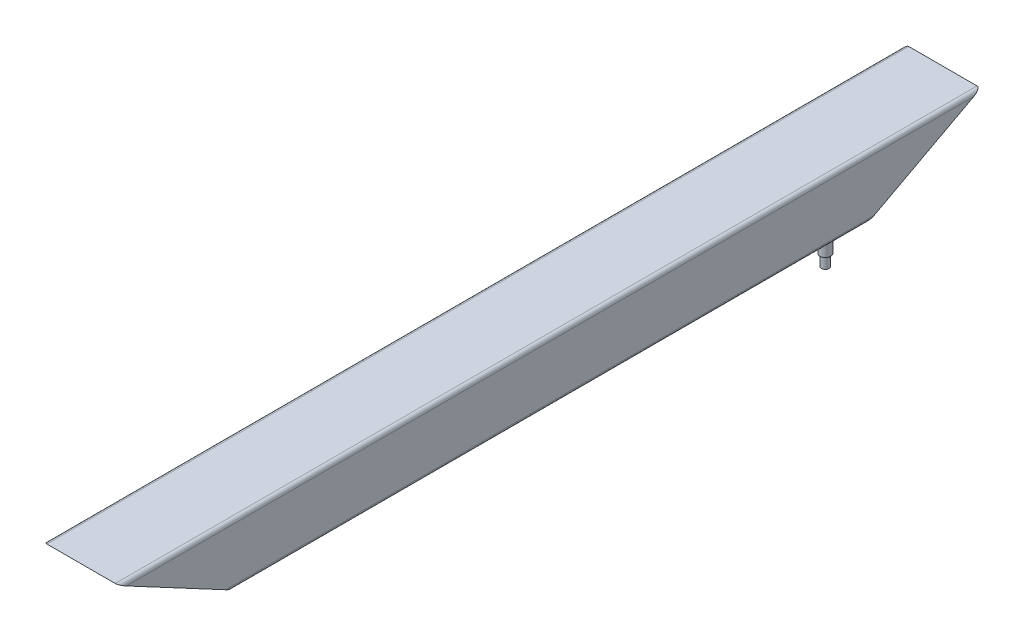
ISO-10303-21;
HEADER;
FILE_DESCRIPTION(('STEP AP214'),'2;1');
FILE_NAME('part.step','',(''),(''),'','','');
FILE_SCHEMA(('AUTOMOTIVE_DESIGN { 1 0 10303 214 1 1 1 1 }'));
ENDSEC;
DATA;
#1=APPLICATION_CONTEXT('core data for automotive mechanical design processes');
#2=APPLICATION_PROTOCOL_DEFINITION('international standard','automotive_design',2000,#1);
#3=PRODUCT_CONTEXT('',#1,'mechanical');
#4=PRODUCT('Part','Part','',(#3));
#5=PRODUCT_RELATED_PRODUCT_CATEGORY('part','',(#4));
#6=PRODUCT_DEFINITION_FORMATION('','',#4);
#7=PRODUCT_DEFINITION_CONTEXT('part definition',#1,'design');
#8=PRODUCT_DEFINITION('design','',#6,#7);
#9=PRODUCT_DEFINITION_SHAPE('','',#8);
#10=(LENGTH_UNIT() NAMED_UNIT(*) SI_UNIT(.MILLI.,.METRE.));
#11=(NAMED_UNIT(*) PLANE_ANGLE_UNIT() SI_UNIT($,.RADIAN.));
#12=(NAMED_UNIT(*) SI_UNIT($,.STERADIAN.) SOLID_ANGLE_UNIT());
#13=UNCERTAINTY_MEASURE_WITH_UNIT(LENGTH_MEASURE(1.E-05),#10,'distance_accuracy_value','');
#14=(GEOMETRIC_REPRESENTATION_CONTEXT(3) GLOBAL_UNCERTAINTY_ASSIGNED_CONTEXT((#13)) GLOBAL_UNIT_ASSIGNED_CONTEXT((#10,
#11,#12)) REPRESENTATION_CONTEXT('',''));
#15=CARTESIAN_POINT('',(0.,0.,0.));
#16=DIRECTION('',(0.,0.,1.));
#17=DIRECTION('',(1.,0.,0.));
#18=AXIS2_PLACEMENT_3D('',#15,#16,#17);
#19=CARTESIAN_POINT('',(5.,75.,1200.));
#20=DIRECTION('',(0.,0.,-1.));
#21=DIRECTION('',(-1.,0.,0.));
#22=AXIS2_PLACEMENT_3D('',#19,#20,#21);
#23=CYLINDRICAL_SURFACE('',#22,5.);
#24=DIRECTION('',(0.,0.,-1.));
#25=VECTOR('',#24,1.);
#26=CARTESIAN_POINT('',(5.,80.,1200.));
#27=LINE('',#26,#25);
#28=CARTESIAN_POINT('',(5.,80.,1200.));
#29=VERTEX_POINT('',#28);
#30=CARTESIAN_POINT('',(5.,80.,64.0000000000001));
#31=VERTEX_POINT('',#30);
#32=EDGE_CURVE('E336',#29,#31,#27,.T.);
#33=ORIENTED_EDGE('',*,*,#32,.T.);
#34=CARTESIAN_POINT('',(5.,75.,73.3750000000001));
#35=DIRECTION('',(0.,0.882352941176471,0.470588235294118));
#36=DIRECTION('',(0.,0.470588235294118,-0.882352941176471));
#37=AXIS2_PLACEMENT_3D('',#34,#35,#36);
#38=ELLIPSE('',#37,10.625,5.);
#39=CARTESIAN_POINT('',(0.,75.,73.3750000000001));
#40=VERTEX_POINT('',#39);
#41=EDGE_CURVE('E98',#31,#40,#38,.T.);
#42=ORIENTED_EDGE('',*,*,#41,.T.);
#43=DIRECTION('',(0.,0.,-1.));
#44=VECTOR('',#43,1.);
#45=CARTESIAN_POINT('',(0.,75.,1200.));
#46=LINE('',#45,#44);
#47=CARTESIAN_POINT('',(0.,74.9999999999999,1190.625));
#48=VERTEX_POINT('',#47);
#49=EDGE_CURVE('E205',#48,#40,#46,.T.);
#50=ORIENTED_EDGE('',*,*,#49,.F.);
#51=CARTESIAN_POINT('',(5.,75.,1190.625));
#52=DIRECTION('',(0.,0.88235294117647,-0.470588235294118));
#53=DIRECTION('',(0.,-0.470588235294118,-0.88235294117647));
#54=AXIS2_PLACEMENT_3D('',#51,#52,#53);
#55=ELLIPSE('',#54,10.625,5.);
#56=EDGE_CURVE('E322',#48,#29,#55,.T.);
#57=ORIENTED_EDGE('',*,*,#56,.T.);
#58=EDGE_LOOP('',(#33,#42,#50,#57));
#59=FACE_BOUND('',#58,.T.);
#60=ADVANCED_FACE('F83',(#59),#23,.T.);
#61=CARTESIAN_POINT('',(0.,5.00000000000004,1200.));
#62=DIRECTION('',(1.,0.,0.));
#63=DIRECTION('',(0.,0.,-1.));
#64=AXIS2_PLACEMENT_3D('',#61,#62,#63);
#65=PLANE('',#64);
#66=ORIENTED_EDGE('',*,*,#49,.T.);
#67=DIRECTION('',(0.,-0.470588235294118,0.882352941176471));
#68=VECTOR('',#67,1.);
#69=CARTESIAN_POINT('',(0.,80.,64.0000000000001));
#70=LINE('',#69,#68);
#71=CARTESIAN_POINT('',(0.,5.,204.625));
#72=VERTEX_POINT('',#71);
#73=EDGE_CURVE('E349',#40,#72,#70,.T.);
#74=ORIENTED_EDGE('',*,*,#73,.T.);
#75=DIRECTION('',(0.,0.,-1.));
#76=VECTOR('',#75,1.);
#77=CARTESIAN_POINT('',(0.,5.00000000000004,1200.));
#78=LINE('',#77,#76);
#79=CARTESIAN_POINT('',(0.,5.,1059.375));
#80=VERTEX_POINT('',#79);
#81=EDGE_CURVE('E202',#80,#72,#78,.T.);
#82=ORIENTED_EDGE('',*,*,#81,.F.);
#83=DIRECTION('',(0.,0.470588235294118,0.88235294117647));
#84=VECTOR('',#83,1.);
#85=CARTESIAN_POINT('',(0.,80.,1200.));
#86=LINE('',#85,#84);
#87=EDGE_CURVE('E367',#80,#48,#86,.T.);
#88=ORIENTED_EDGE('',*,*,#87,.T.);
#89=EDGE_LOOP('',(#66,#74,#82,#88));
#90=FACE_BOUND('',#89,.T.);
#91=ADVANCED_FACE('F248',(#90),#65,.F.);
#92=CARTESIAN_POINT('',(5.,5.,1200.));
#93=DIRECTION('',(0.,0.,-1.));
#94=DIRECTION('',(-1.,0.,0.));
#95=AXIS2_PLACEMENT_3D('',#92,#93,#94);
#96=CYLINDRICAL_SURFACE('',#95,5.);
#97=ORIENTED_EDGE('',*,*,#81,.T.);
#98=CARTESIAN_POINT('',(5.,5.,204.625));
#99=DIRECTION('',(0.,0.882352941176471,0.470588235294118));
#100=DIRECTION('',(0.,0.470588235294118,-0.882352941176471));
#101=AXIS2_PLACEMENT_3D('',#98,#99,#100);
#102=ELLIPSE('',#101,10.625,5.);
#103=CARTESIAN_POINT('',(5.00000000000004,0.,214.));
#104=VERTEX_POINT('',#103);
#105=EDGE_CURVE('E363',#72,#104,#102,.T.);
#106=ORIENTED_EDGE('',*,*,#105,.T.);
#107=DIRECTION('',(0.,0.,-1.));
#108=VECTOR('',#107,1.);
#109=CARTESIAN_POINT('',(5.00000000000004,0.,1200.));
#110=LINE('',#109,#108);
#111=CARTESIAN_POINT('',(5.00000000000004,0.,1050.));
#112=VERTEX_POINT('',#111);
#113=EDGE_CURVE('E186',#112,#104,#110,.T.);
#114=ORIENTED_EDGE('',*,*,#113,.F.);
#115=CARTESIAN_POINT('',(5.,5.,1059.375));
#116=DIRECTION('',(0.,0.88235294117647,-0.470588235294118));
#117=DIRECTION('',(0.,-0.470588235294118,-0.88235294117647));
#118=AXIS2_PLACEMENT_3D('',#115,#116,#117);
#119=ELLIPSE('',#118,10.625,5.);
#120=EDGE_CURVE('E327',#112,#80,#119,.T.);
#121=ORIENTED_EDGE('',*,*,#120,.T.);
#122=EDGE_LOOP('',(#97,#106,#114,#121));
#123=FACE_BOUND('',#122,.T.);
#124=ADVANCED_FACE('F254',(#123),#96,.T.);
#125=CARTESIAN_POINT('',(5.00000000000004,0.,1200.));
#126=DIRECTION('',(0.,1.,0.));
#127=DIRECTION('',(0.,0.,1.));
#128=AXIS2_PLACEMENT_3D('',#125,#126,#127);
#129=PLANE('',#128);
#130=CARTESIAN_POINT('',(50.,0.,354.));
#131=DIRECTION('',(0.,-1.,0.));
#132=DIRECTION('',(0.,0.,-1.));
#133=AXIS2_PLACEMENT_3D('',#130,#131,#132);
#134=CIRCLE('',#133,3.40000000000001);
#135=CARTESIAN_POINT('',(50.,0.,350.6));
#136=VERTEX_POINT('',#135);
#137=EDGE_CURVE('E431',#136,#136,#134,.T.);
#138=ORIENTED_EDGE('',*,*,#137,.F.);
#139=EDGE_LOOP('',(#138));
#140=FACE_BOUND('',#139,.T.);
#141=CARTESIAN_POINT('',(10.,0.,354.));
#142=DIRECTION('',(0.,-1.,0.));
#143=DIRECTION('',(0.,0.,-1.));
#144=AXIS2_PLACEMENT_3D('',#141,#142,#143);
#145=CIRCLE('',#144,3.40000000000001);
#146=CARTESIAN_POINT('',(10.,0.,350.6));
#147=VERTEX_POINT('',#146);
#148=EDGE_CURVE('E217',#147,#147,#145,.T.);
#149=ORIENTED_EDGE('',*,*,#148,.F.);
#150=EDGE_LOOP('',(#149));
#151=FACE_BOUND('',#150,.T.);
#152=DIRECTION('',(0.,0.,-1.));
#153=VECTOR('',#152,1.);
#154=CARTESIAN_POINT('',(95.,0.,1200.));
#155=LINE('',#154,#153);
#156=CARTESIAN_POINT('',(95.,0.,257.));
#157=VERTEX_POINT('',#156);
#158=CARTESIAN_POINT('',(95.,0.,214.));
#159=VERTEX_POINT('',#158);
#160=EDGE_CURVE('E179',#157,#159,#155,.T.);
#161=ORIENTED_EDGE('',*,*,#160,.F.);
#162=CARTESIAN_POINT('',(88.,0.,257.));
#163=DIRECTION('',(0.,-1.,0.));
#164=DIRECTION('',(0.,0.,-1.));
#165=AXIS2_PLACEMENT_3D('',#162,#163,#164);
#166=CIRCLE('',#165,7.);
#167=EDGE_CURVE('E192',#157,#157,#166,.T.);
#168=ORIENTED_EDGE('',*,*,#167,.F.);
#169=CARTESIAN_POINT('',(95.,0.,1050.));
#170=VERTEX_POINT('',#169);
#171=EDGE_CURVE('E175',#170,#157,#155,.T.);
#172=ORIENTED_EDGE('',*,*,#171,.F.);
#173=DIRECTION('',(1.,0.,0.));
#174=VECTOR('',#173,1.);
#175=CARTESIAN_POINT('',(0.,0.,1050.));
#176=LINE('',#175,#174);
#177=EDGE_CURVE('E370',#112,#170,#176,.T.);
#178=ORIENTED_EDGE('',*,*,#177,.F.);
#179=ORIENTED_EDGE('',*,*,#113,.T.);
#180=DIRECTION('',(1.,0.,0.));
#181=VECTOR('',#180,1.);
#182=CARTESIAN_POINT('',(0.,0.,214.));
#183=LINE('',#182,#181);
#184=EDGE_CURVE('E194',#104,#159,#183,.T.);
#185=ORIENTED_EDGE('',*,*,#184,.T.);
#186=EDGE_LOOP('',(#161,#168,#172,#178,#179,#185));
#187=FACE_BOUND('',#186,.T.);
#188=CARTESIAN_POINT('',(10.,0.,390.));
#189=DIRECTION('',(0.,-1.,0.));
#190=DIRECTION('',(0.,0.,-1.));
#191=AXIS2_PLACEMENT_3D('',#188,#189,#190);
#192=CIRCLE('',#191,3.40000000000001);
#193=CARTESIAN_POINT('',(10.,0.,386.6));
#194=VERTEX_POINT('',#193);
#195=EDGE_CURVE('E220',#194,#194,#192,.T.);
#196=ORIENTED_EDGE('',*,*,#195,.F.);
#197=EDGE_LOOP('',(#196));
#198=FACE_BOUND('',#197,.T.);
#199=CARTESIAN_POINT('',(50.,0.,390.));
#200=DIRECTION('',(0.,-1.,0.));
#201=DIRECTION('',(0.,0.,-1.));
#202=AXIS2_PLACEMENT_3D('',#199,#200,#201);
#203=CIRCLE('',#202,3.40000000000001);
#204=CARTESIAN_POINT('',(50.,0.,386.6));
#205=VERTEX_POINT('',#204);
#206=EDGE_CURVE('E12',#205,#205,#203,.T.);
#207=ORIENTED_EDGE('',*,*,#206,.F.);
#208=EDGE_LOOP('',(#207));
#209=FACE_BOUND('',#208,.T.);
#210=ADVANCED_FACE('F189',(#140,#151,#187,#198,#209),#129,.F.);
#211=CARTESIAN_POINT('',(95.,5.,1200.));
#212=DIRECTION('',(0.,0.,-1.));
#213=DIRECTION('',(-1.,0.,0.));
#214=AXIS2_PLACEMENT_3D('',#211,#212,#213);
#215=CYLINDRICAL_SURFACE('',#214,5.);
#216=ORIENTED_EDGE('',*,*,#171,.T.);
#217=ORIENTED_EDGE('',*,*,#160,.T.);
#218=CARTESIAN_POINT('',(95.,5.,204.625));
#219=DIRECTION('',(0.,0.882352941176471,0.470588235294118));
#220=DIRECTION('',(0.,0.470588235294118,-0.882352941176471));
#221=AXIS2_PLACEMENT_3D('',#218,#219,#220);
#222=ELLIPSE('',#221,10.625,5.);
#223=CARTESIAN_POINT('',(100.,4.99999999999999,204.625));
#224=VERTEX_POINT('',#223);
#225=EDGE_CURVE('E361',#159,#224,#222,.T.);
#226=ORIENTED_EDGE('',*,*,#225,.T.);
#227=DIRECTION('',(0.,0.,-1.));
#228=VECTOR('',#227,1.);
#229=CARTESIAN_POINT('',(100.,5.00000000000003,1200.));
#230=LINE('',#229,#228);
#231=CARTESIAN_POINT('',(100.,5.00000000000009,1059.375));
#232=VERTEX_POINT('',#231);
#233=EDGE_CURVE('E195',#232,#224,#230,.T.);
#234=ORIENTED_EDGE('',*,*,#233,.F.);
#235=CARTESIAN_POINT('',(95.,5.,1059.375));
#236=DIRECTION('',(0.,0.88235294117647,-0.470588235294118));
#237=DIRECTION('',(0.,-0.470588235294118,-0.88235294117647));
#238=AXIS2_PLACEMENT_3D('',#235,#236,#237);
#239=ELLIPSE('',#238,10.625,5.);
#240=EDGE_CURVE('E182',#232,#170,#239,.T.);
#241=ORIENTED_EDGE('',*,*,#240,.T.);
#242=EDGE_LOOP('',(#216,#217,#226,#234,#241));
#243=FACE_BOUND('',#242,.T.);
#244=ADVANCED_FACE('F177',(#243),#215,.T.);
#245=CARTESIAN_POINT('',(100.,5.00000000000004,1200.));
#246=DIRECTION('',(-1.,0.,0.));
#247=DIRECTION('',(0.,0.,1.));
#248=AXIS2_PLACEMENT_3D('',#245,#246,#247);
#249=PLANE('',#248);
#250=ORIENTED_EDGE('',*,*,#233,.T.);
#251=DIRECTION('',(0.,-0.470588235294118,0.882352941176471));
#252=VECTOR('',#251,1.);
#253=CARTESIAN_POINT('',(100.,80.,64.0000000000001));
#254=LINE('',#253,#252);
#255=CARTESIAN_POINT('',(100.,75.,73.3750000000001));
#256=VERTEX_POINT('',#255);
#257=EDGE_CURVE('E216',#256,#224,#254,.T.);
#258=ORIENTED_EDGE('',*,*,#257,.F.);
#259=DIRECTION('',(0.,0.,-1.));
#260=VECTOR('',#259,1.);
#261=CARTESIAN_POINT('',(100.,75.,1200.));
#262=LINE('',#261,#260);
#263=CARTESIAN_POINT('',(100.,75.,1190.625));
#264=VERTEX_POINT('',#263);
#265=EDGE_CURVE('E197',#264,#256,#262,.T.);
#266=ORIENTED_EDGE('',*,*,#265,.F.);
#267=DIRECTION('',(0.,0.470588235294118,0.88235294117647));
#268=VECTOR('',#267,1.);
#269=CARTESIAN_POINT('',(100.,80.,1200.));
#270=LINE('',#269,#268);
#271=EDGE_CURVE('E348',#232,#264,#270,.T.);
#272=ORIENTED_EDGE('',*,*,#271,.F.);
#273=EDGE_LOOP('',(#250,#258,#266,#272));
#274=FACE_BOUND('',#273,.T.);
#275=ADVANCED_FACE('F283',(#274),#249,.F.);
#276=CARTESIAN_POINT('',(95.,75.,1200.));
#277=DIRECTION('',(0.,0.,-1.));
#278=DIRECTION('',(-1.,0.,0.));
#279=AXIS2_PLACEMENT_3D('',#276,#277,#278);
#280=CYLINDRICAL_SURFACE('',#279,5.);
#281=ORIENTED_EDGE('',*,*,#265,.T.);
#282=CARTESIAN_POINT('',(95.,75.,73.3750000000001));
#283=DIRECTION('',(0.,0.882352941176471,0.470588235294118));
#284=DIRECTION('',(0.,0.470588235294118,-0.882352941176471));
#285=AXIS2_PLACEMENT_3D('',#282,#283,#284);
#286=ELLIPSE('',#285,10.625,5.);
#287=CARTESIAN_POINT('',(95.,80.,64.0000000000001));
#288=VERTEX_POINT('',#287);
#289=EDGE_CURVE('E315',#256,#288,#286,.T.);
#290=ORIENTED_EDGE('',*,*,#289,.T.);
#291=DIRECTION('',(0.,0.,-1.));
#292=VECTOR('',#291,1.);
#293=CARTESIAN_POINT('',(95.,80.,1200.));
#294=LINE('',#293,#292);
#295=CARTESIAN_POINT('',(95.,80.,1200.));
#296=VERTEX_POINT('',#295);
#297=EDGE_CURVE('E338',#296,#288,#294,.T.);
#298=ORIENTED_EDGE('',*,*,#297,.F.);
#299=CARTESIAN_POINT('',(95.,75.,1190.625));
#300=DIRECTION('',(0.,0.88235294117647,-0.470588235294118));
#301=DIRECTION('',(0.,-0.470588235294118,-0.88235294117647));
#302=AXIS2_PLACEMENT_3D('',#299,#300,#301);
#303=ELLIPSE('',#302,10.625,5.);
#304=EDGE_CURVE('E345',#296,#264,#303,.T.);
#305=ORIENTED_EDGE('',*,*,#304,.T.);
#306=EDGE_LOOP('',(#281,#290,#298,#305));
#307=FACE_BOUND('',#306,.T.);
#308=ADVANCED_FACE('F292',(#307),#280,.T.);
#309=CARTESIAN_POINT('',(5.,80.,1200.));
#310=DIRECTION('',(0.,-1.,0.));
#311=DIRECTION('',(0.,0.,-1.));
#312=AXIS2_PLACEMENT_3D('',#309,#310,#311);
#313=PLANE('',#312);
#314=ORIENTED_EDGE('',*,*,#297,.T.);
#315=DIRECTION('',(1.,0.,0.));
#316=VECTOR('',#315,1.);
#317=CARTESIAN_POINT('',(0.,80.,64.0000000000001));
#318=LINE('',#317,#316);
#319=EDGE_CURVE('E352',#31,#288,#318,.T.);
#320=ORIENTED_EDGE('',*,*,#319,.F.);
#321=ORIENTED_EDGE('',*,*,#32,.F.);
#322=DIRECTION('',(-1.,0.,0.));
#323=VECTOR('',#322,1.);
#324=CARTESIAN_POINT('',(5.,80.,1200.));
#325=LINE('',#324,#323);
#326=EDGE_CURVE('E334',#296,#29,#325,.T.);
#327=ORIENTED_EDGE('',*,*,#326,.F.);
#328=EDGE_LOOP('',(#314,#320,#321,#327));
#329=FACE_BOUND('',#328,.T.);
#330=ADVANCED_FACE('F296',(#329),#313,.F.);
#331=CARTESIAN_POINT('',(5.,74.,1200.));
#332=DIRECTION('',(0.,-1.,0.));
#333=DIRECTION('',(0.,0.,-1.));
#334=AXIS2_PLACEMENT_3D('',#331,#332,#333);
#335=PLANE('',#334);
#336=DIRECTION('',(-1.,0.,0.));
#337=VECTOR('',#336,1.);
#338=CARTESIAN_POINT('',(5.,74.,75.2500000000001));
#339=LINE('',#338,#337);
#340=CARTESIAN_POINT('',(94.,74.,75.2500000000002));
#341=VERTEX_POINT('',#340);
#342=CARTESIAN_POINT('',(6.,74.,75.2500000000002));
#343=VERTEX_POINT('',#342);
#344=EDGE_CURVE('E308',#341,#343,#339,.T.);
#345=ORIENTED_EDGE('',*,*,#344,.F.);
#346=DIRECTION('',(0.,0.,-1.));
#347=VECTOR('',#346,1.);
#348=CARTESIAN_POINT('',(94.,74.,1200.));
#349=LINE('',#348,#347);
#350=CARTESIAN_POINT('',(94.,74.,1188.75));
#351=VERTEX_POINT('',#350);
#352=EDGE_CURVE('E311',#351,#341,#349,.T.);
#353=ORIENTED_EDGE('',*,*,#352,.F.);
#354=DIRECTION('',(1.,0.,0.));
#355=VECTOR('',#354,1.);
#356=CARTESIAN_POINT('',(5.,74.,1188.75));
#357=LINE('',#356,#355);
#358=CARTESIAN_POINT('',(6.,74.,1188.75));
#359=VERTEX_POINT('',#358);
#360=EDGE_CURVE('E377',#359,#351,#357,.T.);
#361=ORIENTED_EDGE('',*,*,#360,.F.);
#362=DIRECTION('',(0.,0.,-1.));
#363=VECTOR('',#362,1.);
#364=CARTESIAN_POINT('',(6.,74.,1200.));
#365=LINE('',#364,#363);
#366=EDGE_CURVE('E313',#359,#343,#365,.T.);
#367=ORIENTED_EDGE('',*,*,#366,.T.);
#368=EDGE_LOOP('',(#345,#353,#361,#367));
#369=FACE_BOUND('',#368,.T.);
#370=ADVANCED_FACE('F242',(#369),#335,.T.);
#371=CARTESIAN_POINT('',(6.,75.,1200.));
#372=DIRECTION('',(1.,0.,0.));
#373=DIRECTION('',(0.,0.,-1.));
#374=AXIS2_PLACEMENT_3D('',#371,#372,#373);
#375=PLANE('',#374);
#376=DIRECTION('',(0.,-0.470588235294118,0.882352941176471));
#377=VECTOR('',#376,1.);
#378=CARTESIAN_POINT('',(6.,-392.80276816609,950.505190311419));
#379=LINE('',#378,#377);
#380=CARTESIAN_POINT('',(6.,6.00000000000001,202.75));
#381=VERTEX_POINT('',#380);
#382=EDGE_CURVE('E316',#343,#381,#379,.T.);
#383=ORIENTED_EDGE('',*,*,#382,.F.);
#384=ORIENTED_EDGE('',*,*,#366,.F.);
#385=DIRECTION('',(0.,0.470588235294118,0.88235294117647));
#386=VECTOR('',#385,1.);
#387=CARTESIAN_POINT('',(6.,78.8927335640138,1197.92387543253));
#388=LINE('',#387,#386);
#389=CARTESIAN_POINT('',(6.,6.00000000000001,1061.25));
#390=VERTEX_POINT('',#389);
#391=EDGE_CURVE('E375',#390,#359,#388,.T.);
#392=ORIENTED_EDGE('',*,*,#391,.F.);
#393=DIRECTION('',(0.,0.,-1.));
#394=VECTOR('',#393,1.);
#395=CARTESIAN_POINT('',(6.,6.,1200.));
#396=LINE('',#395,#394);
#397=EDGE_CURVE('E324',#390,#381,#396,.T.);
#398=ORIENTED_EDGE('',*,*,#397,.T.);
#399=EDGE_LOOP('',(#383,#384,#392,#398));
#400=FACE_BOUND('',#399,.T.);
#401=ADVANCED_FACE('F230',(#400),#375,.T.);
#402=CARTESIAN_POINT('',(5.,6.00000000000001,1200.));
#403=DIRECTION('',(0.,1.,0.));
#404=DIRECTION('',(0.,0.,1.));
#405=AXIS2_PLACEMENT_3D('',#402,#403,#404);
#406=PLANE('',#405);
#407=CARTESIAN_POINT('',(50.,6.,354.));
#408=DIRECTION('',(0.,1.,0.));
#409=DIRECTION('',(0.,0.,1.));
#410=AXIS2_PLACEMENT_3D('',#407,#408,#409);
#411=CIRCLE('',#410,3.40000000000001);
#412=CARTESIAN_POINT('',(50.,6.,357.4));
#413=VERTEX_POINT('',#412);
#414=EDGE_CURVE('E427',#413,#413,#411,.T.);
#415=ORIENTED_EDGE('',*,*,#414,.F.);
#416=EDGE_LOOP('',(#415));
#417=FACE_BOUND('',#416,.T.);
#418=CARTESIAN_POINT('',(10.,6.00000000000001,354.));
#419=DIRECTION('',(0.,1.,0.));
#420=DIRECTION('',(0.,0.,1.));
#421=AXIS2_PLACEMENT_3D('',#418,#419,#420);
#422=CIRCLE('',#421,3.40000000000001);
#423=CARTESIAN_POINT('',(10.,6.00000000000001,357.4));
#424=VERTEX_POINT('',#423);
#425=EDGE_CURVE('E213',#424,#424,#422,.T.);
#426=ORIENTED_EDGE('',*,*,#425,.F.);
#427=EDGE_LOOP('',(#426));
#428=FACE_BOUND('',#427,.T.);
#429=DIRECTION('',(1.,0.,0.));
#430=VECTOR('',#429,1.);
#431=CARTESIAN_POINT('',(5.,6.00000000000001,202.75));
#432=LINE('',#431,#430);
#433=CARTESIAN_POINT('',(94.,5.99999999999999,202.75));
#434=VERTEX_POINT('',#433);
#435=EDGE_CURVE('E106',#381,#434,#432,.T.);
#436=ORIENTED_EDGE('',*,*,#435,.F.);
#437=ORIENTED_EDGE('',*,*,#397,.F.);
#438=DIRECTION('',(-1.,0.,0.));
#439=VECTOR('',#438,1.);
#440=CARTESIAN_POINT('',(5.,6.00000000000001,1061.25));
#441=LINE('',#440,#439);
#442=CARTESIAN_POINT('',(94.,6.,1061.25));
#443=VERTEX_POINT('',#442);
#444=EDGE_CURVE('E373',#443,#390,#441,.T.);
#445=ORIENTED_EDGE('',*,*,#444,.F.);
#446=DIRECTION('',(0.,0.,-1.));
#447=VECTOR('',#446,1.);
#448=CARTESIAN_POINT('',(94.,6.,1200.));
#449=LINE('',#448,#447);
#450=EDGE_CURVE('E321',#443,#434,#449,.T.);
#451=ORIENTED_EDGE('',*,*,#450,.T.);
#452=EDGE_LOOP('',(#436,#437,#445,#451));
#453=FACE_BOUND('',#452,.T.);
#454=CARTESIAN_POINT('',(10.,6.00000000000001,390.));
#455=DIRECTION('',(0.,1.,0.));
#456=DIRECTION('',(0.,0.,1.));
#457=AXIS2_PLACEMENT_3D('',#454,#455,#456);
#458=CIRCLE('',#457,3.40000000000001);
#459=CARTESIAN_POINT('',(10.,6.00000000000001,393.4));
#460=VERTEX_POINT('',#459);
#461=EDGE_CURVE('E212',#460,#460,#458,.T.);
#462=ORIENTED_EDGE('',*,*,#461,.F.);
#463=EDGE_LOOP('',(#462));
#464=FACE_BOUND('',#463,.T.);
#465=CARTESIAN_POINT('',(50.,6.,390.));
#466=DIRECTION('',(0.,1.,0.));
#467=DIRECTION('',(0.,0.,1.));
#468=AXIS2_PLACEMENT_3D('',#465,#466,#467);
#469=CIRCLE('',#468,3.40000000000001);
#470=CARTESIAN_POINT('',(50.,6.,393.4));
#471=VERTEX_POINT('',#470);
#472=EDGE_CURVE('E91',#471,#471,#469,.T.);
#473=ORIENTED_EDGE('',*,*,#472,.F.);
#474=EDGE_LOOP('',(#473));
#475=FACE_BOUND('',#474,.T.);
#476=ADVANCED_FACE('F227',(#417,#428,#453,#464,#475),#406,.T.);
#477=CARTESIAN_POINT('',(94.,75.,1200.));
#478=DIRECTION('',(-1.,0.,0.));
#479=DIRECTION('',(0.,0.,1.));
#480=AXIS2_PLACEMENT_3D('',#477,#478,#479);
#481=PLANE('',#480);
#482=DIRECTION('',(0.,0.470588235294118,-0.882352941176471));
#483=VECTOR('',#482,1.);
#484=CARTESIAN_POINT('',(94.,-392.80276816609,950.505190311419));
#485=LINE('',#484,#483);
#486=EDGE_CURVE('E210',#434,#341,#485,.T.);
#487=ORIENTED_EDGE('',*,*,#486,.F.);
#488=ORIENTED_EDGE('',*,*,#450,.F.);
#489=DIRECTION('',(0.,-0.470588235294118,-0.88235294117647));
#490=VECTOR('',#489,1.);
#491=CARTESIAN_POINT('',(94.,78.8927335640138,1197.92387543253));
#492=LINE('',#491,#490);
#493=EDGE_CURVE('E208',#351,#443,#492,.T.);
#494=ORIENTED_EDGE('',*,*,#493,.F.);
#495=ORIENTED_EDGE('',*,*,#352,.T.);
#496=EDGE_LOOP('',(#487,#488,#494,#495));
#497=FACE_BOUND('',#496,.T.);
#498=ADVANCED_FACE('F229',(#497),#481,.T.);
#499=CARTESIAN_POINT('',(0.,80.,1200.));
#500=DIRECTION('',(0.,0.88235294117647,-0.470588235294118));
#501=DIRECTION('',(0.,0.470588235294118,0.882352941176471));
#502=AXIS2_PLACEMENT_3D('',#499,#500,#501);
#503=PLANE('',#502);
#504=ORIENTED_EDGE('',*,*,#360,.T.);
#505=ORIENTED_EDGE('',*,*,#493,.T.);
#506=ORIENTED_EDGE('',*,*,#444,.T.);
#507=ORIENTED_EDGE('',*,*,#391,.T.);
#508=EDGE_LOOP('',(#504,#505,#506,#507));
#509=FACE_BOUND('',#508,.T.);
#510=ORIENTED_EDGE('',*,*,#87,.F.);
#511=ORIENTED_EDGE('',*,*,#120,.F.);
#512=ORIENTED_EDGE('',*,*,#177,.T.);
#513=ORIENTED_EDGE('',*,*,#240,.F.);
#514=ORIENTED_EDGE('',*,*,#271,.T.);
#515=ORIENTED_EDGE('',*,*,#304,.F.);
#516=ORIENTED_EDGE('',*,*,#326,.T.);
#517=ORIENTED_EDGE('',*,*,#56,.F.);
#518=EDGE_LOOP('',(#510,#511,#512,#513,#514,#515,#516,#517));
#519=FACE_BOUND('',#518,.T.);
#520=ADVANCED_FACE('F238',(#509,#519),#503,.F.);
#521=CARTESIAN_POINT('',(0.,80.,64.0000000000001));
#522=DIRECTION('',(0.,0.882352941176471,0.470588235294118));
#523=DIRECTION('',(0.,-0.470588235294118,0.882352941176471));
#524=AXIS2_PLACEMENT_3D('',#521,#522,#523);
#525=PLANE('',#524);
#526=ORIENTED_EDGE('',*,*,#344,.T.);
#527=ORIENTED_EDGE('',*,*,#382,.T.);
#528=ORIENTED_EDGE('',*,*,#435,.T.);
#529=ORIENTED_EDGE('',*,*,#486,.T.);
#530=EDGE_LOOP('',(#526,#527,#528,#529));
#531=FACE_BOUND('',#530,.T.);
#532=ORIENTED_EDGE('',*,*,#319,.T.);
#533=ORIENTED_EDGE('',*,*,#289,.F.);
#534=ORIENTED_EDGE('',*,*,#257,.T.);
#535=ORIENTED_EDGE('',*,*,#225,.F.);
#536=ORIENTED_EDGE('',*,*,#184,.F.);
#537=ORIENTED_EDGE('',*,*,#105,.F.);
#538=ORIENTED_EDGE('',*,*,#73,.F.);
#539=ORIENTED_EDGE('',*,*,#41,.F.);
#540=EDGE_LOOP('',(#532,#533,#534,#535,#536,#537,#538,#539));
#541=FACE_BOUND('',#540,.T.);
#542=ADVANCED_FACE('F385',(#531,#541),#525,.F.);
#543=CARTESIAN_POINT('',(10.,10.,354.));
#544=DIRECTION('',(0.,-1.,0.));
#545=DIRECTION('',(0.,0.,-1.));
#546=AXIS2_PLACEMENT_3D('',#543,#544,#545);
#547=CYLINDRICAL_SURFACE('',#546,3.40000000000001);
#548=ORIENTED_EDGE('',*,*,#425,.T.);
#549=EDGE_LOOP('',(#548));
#550=FACE_BOUND('',#549,.T.);
#551=ORIENTED_EDGE('',*,*,#148,.T.);
#552=EDGE_LOOP('',(#551));
#553=FACE_BOUND('',#552,.T.);
#554=ADVANCED_FACE('F268',(#550,#553),#547,.F.);
#555=CARTESIAN_POINT('',(50.,10.,354.));
#556=DIRECTION('',(0.,-1.,0.));
#557=DIRECTION('',(0.,0.,-1.));
#558=AXIS2_PLACEMENT_3D('',#555,#556,#557);
#559=CYLINDRICAL_SURFACE('',#558,3.40000000000001);
#560=ORIENTED_EDGE('',*,*,#414,.T.);
#561=EDGE_LOOP('',(#560));
#562=FACE_BOUND('',#561,.T.);
#563=ORIENTED_EDGE('',*,*,#137,.T.);
#564=EDGE_LOOP('',(#563));
#565=FACE_BOUND('',#564,.T.);
#566=ADVANCED_FACE('F261',(#562,#565),#559,.F.);
#567=CARTESIAN_POINT('',(10.,10.,390.));
#568=DIRECTION('',(0.,-1.,0.));
#569=DIRECTION('',(0.,0.,-1.));
#570=AXIS2_PLACEMENT_3D('',#567,#568,#569);
#571=CYLINDRICAL_SURFACE('',#570,3.40000000000001);
#572=ORIENTED_EDGE('',*,*,#461,.T.);
#573=EDGE_LOOP('',(#572));
#574=FACE_BOUND('',#573,.T.);
#575=ORIENTED_EDGE('',*,*,#195,.T.);
#576=EDGE_LOOP('',(#575));
#577=FACE_BOUND('',#576,.T.);
#578=ADVANCED_FACE('F259',(#574,#577),#571,.F.);
#579=CARTESIAN_POINT('',(50.,10.,390.));
#580=DIRECTION('',(0.,-1.,0.));
#581=DIRECTION('',(0.,0.,-1.));
#582=AXIS2_PLACEMENT_3D('',#579,#580,#581);
#583=CYLINDRICAL_SURFACE('',#582,3.40000000000001);
#584=ORIENTED_EDGE('',*,*,#472,.T.);
#585=EDGE_LOOP('',(#584));
#586=FACE_BOUND('',#585,.T.);
#587=ORIENTED_EDGE('',*,*,#206,.T.);
#588=EDGE_LOOP('',(#587));
#589=FACE_BOUND('',#588,.T.);
#590=ADVANCED_FACE('F85',(#586,#589),#583,.F.);
#591=CARTESIAN_POINT('',(88.,-18.,257.));
#592=DIRECTION('',(0.,1.,0.));
#593=DIRECTION('',(0.,0.,1.));
#594=AXIS2_PLACEMENT_3D('',#591,#592,#593);
#595=CYLINDRICAL_SURFACE('',#594,7.);
#596=CARTESIAN_POINT('',(88.,-18.,257.));
#597=DIRECTION('',(0.,-1.,0.));
#598=DIRECTION('',(0.,0.,-1.));
#599=AXIS2_PLACEMENT_3D('',#596,#597,#598);
#600=CIRCLE('',#599,7.);
#601=CARTESIAN_POINT('',(88.,-18.,250.));
#602=VERTEX_POINT('',#601);
#603=EDGE_CURVE('E421',#602,#602,#600,.T.);
#604=ORIENTED_EDGE('',*,*,#603,.F.);
#605=EDGE_LOOP('',(#604));
#606=FACE_BOUND('',#605,.T.);
#607=ORIENTED_EDGE('',*,*,#167,.T.);
#608=EDGE_LOOP('',(#607));
#609=FACE_BOUND('',#608,.T.);
#610=ADVANCED_FACE('F267',(#606,#609),#595,.T.);
#611=CARTESIAN_POINT('',(88.,-18.,257.));
#612=DIRECTION('',(0.,-1.,0.));
#613=DIRECTION('',(0.,0.,-1.));
#614=AXIS2_PLACEMENT_3D('',#611,#612,#613);
#615=PLANE('',#614);
#616=CARTESIAN_POINT('',(88.,-18.,257.));
#617=DIRECTION('',(0.,-1.,0.));
#618=DIRECTION('',(0.,0.,-1.));
#619=AXIS2_PLACEMENT_3D('',#616,#617,#618);
#620=CIRCLE('',#619,5.00000000000001);
#621=CARTESIAN_POINT('',(88.,-18.,252.));
#622=VERTEX_POINT('',#621);
#623=EDGE_CURVE('E419',#622,#622,#620,.T.);
#624=ORIENTED_EDGE('',*,*,#623,.F.);
#625=EDGE_LOOP('',(#624));
#626=FACE_BOUND('',#625,.T.);
#627=ORIENTED_EDGE('',*,*,#603,.T.);
#628=EDGE_LOOP('',(#627));
#629=FACE_BOUND('',#628,.T.);
#630=ADVANCED_FACE('F401',(#626,#629),#615,.T.);
#631=CARTESIAN_POINT('',(88.,-33.,257.));
#632=DIRECTION('',(0.,1.,0.));
#633=DIRECTION('',(0.,0.,1.));
#634=AXIS2_PLACEMENT_3D('',#631,#632,#633);
#635=CYLINDRICAL_SURFACE('',#634,5.00000000000001);
#636=CARTESIAN_POINT('',(88.,-33.,257.));
#637=DIRECTION('',(0.,-1.,0.));
#638=DIRECTION('',(0.,0.,-1.));
#639=AXIS2_PLACEMENT_3D('',#636,#637,#638);
#640=CIRCLE('',#639,5.00000000000001);
#641=CARTESIAN_POINT('',(88.,-33.,252.));
#642=VERTEX_POINT('',#641);
#643=EDGE_CURVE('E418',#642,#642,#640,.T.);
#644=ORIENTED_EDGE('',*,*,#643,.F.);
#645=EDGE_LOOP('',(#644));
#646=FACE_BOUND('',#645,.T.);
#647=ORIENTED_EDGE('',*,*,#623,.T.);
#648=EDGE_LOOP('',(#647));
#649=FACE_BOUND('',#648,.T.);
#650=ADVANCED_FACE('F405',(#646,#649),#635,.T.);
#651=CARTESIAN_POINT('',(88.,-33.,257.));
#652=DIRECTION('',(0.,-1.,0.));
#653=DIRECTION('',(0.,0.,-1.));
#654=AXIS2_PLACEMENT_3D('',#651,#652,#653);
#655=PLANE('',#654);
#656=ORIENTED_EDGE('',*,*,#643,.T.);
#657=EDGE_LOOP('',(#656));
#658=FACE_BOUND('',#657,.T.);
#659=ADVANCED_FACE('F409',(#658),#655,.T.);
#660=CLOSED_SHELL('',(#60,#91,#124,#210,#244,#275,#308,#330,#370,#401,#476,#498,#520,#542,#554,
#566,#578,#590,#610,#630,#650,#659));
#661=MANIFOLD_SOLID_BREP('B2',#660);
#662=ADVANCED_BREP_SHAPE_REPRESENTATION('',(#18,#661),#14);
#663=SHAPE_DEFINITION_REPRESENTATION(#9,#662);
ENDSEC;
END-ISO-10303-21;
